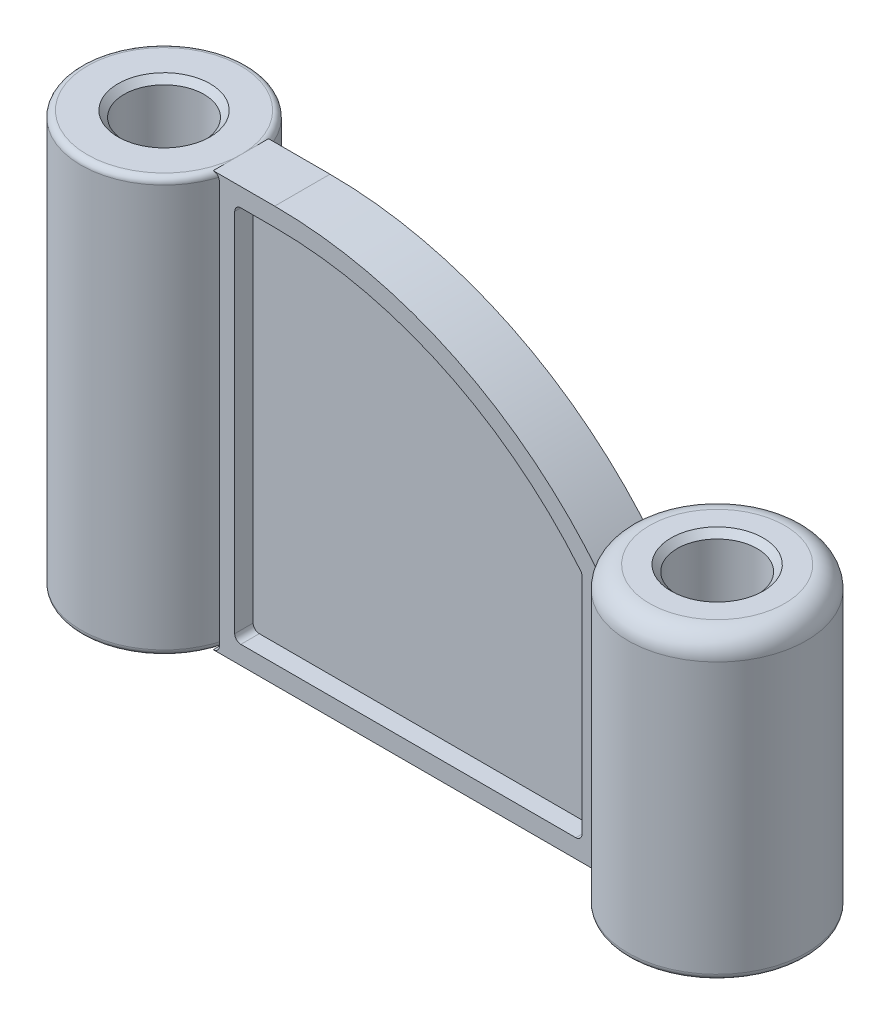
ISO-10303-21;
HEADER;
FILE_DESCRIPTION(('STEP AP214'),'2;1');
FILE_NAME('part.step','',(''),(''),'','','');
FILE_SCHEMA(('AUTOMOTIVE_DESIGN { 1 0 10303 214 1 1 1 1 }'));
ENDSEC;
DATA;
#1=APPLICATION_CONTEXT('core data for automotive mechanical design processes');
#2=APPLICATION_PROTOCOL_DEFINITION('international standard','automotive_design',2000,#1);
#3=PRODUCT_CONTEXT('',#1,'mechanical');
#4=PRODUCT('Part','Part','',(#3));
#5=PRODUCT_RELATED_PRODUCT_CATEGORY('part','',(#4));
#6=PRODUCT_DEFINITION_FORMATION('','',#4);
#7=PRODUCT_DEFINITION_CONTEXT('part definition',#1,'design');
#8=PRODUCT_DEFINITION('design','',#6,#7);
#9=PRODUCT_DEFINITION_SHAPE('','',#8);
#10=(LENGTH_UNIT() NAMED_UNIT(*) SI_UNIT(.MILLI.,.METRE.));
#11=(NAMED_UNIT(*) PLANE_ANGLE_UNIT() SI_UNIT($,.RADIAN.));
#12=(NAMED_UNIT(*) SI_UNIT($,.STERADIAN.) SOLID_ANGLE_UNIT());
#13=UNCERTAINTY_MEASURE_WITH_UNIT(LENGTH_MEASURE(1.E-05),#10,'distance_accuracy_value','');
#14=(GEOMETRIC_REPRESENTATION_CONTEXT(3) GLOBAL_UNCERTAINTY_ASSIGNED_CONTEXT((#13)) GLOBAL_UNIT_ASSIGNED_CONTEXT((#10,
#11,#12)) REPRESENTATION_CONTEXT('',''));
#15=CARTESIAN_POINT('',(0.,0.,0.));
#16=DIRECTION('',(0.,0.,1.));
#17=DIRECTION('',(1.,0.,0.));
#18=AXIS2_PLACEMENT_3D('',#15,#16,#17);
#19=CARTESIAN_POINT('',(54.,8.00000000000001,-9.));
#20=DIRECTION('',(0.,0.,1.));
#21=DIRECTION('',(1.,0.,0.));
#22=AXIS2_PLACEMENT_3D('',#19,#20,#21);
#23=CYLINDRICAL_SURFACE('',#22,2.00000000000001);
#24=CARTESIAN_POINT('',(54.,8.00000000000001,-3.));
#25=DIRECTION('',(0.,0.,1.));
#26=DIRECTION('',(1.,0.,0.));
#27=AXIS2_PLACEMENT_3D('',#24,#25,#26);
#28=CIRCLE('',#27,2.00000000000001);
#29=CARTESIAN_POINT('',(54.,6.,-3.));
#30=VERTEX_POINT('',#29);
#31=CARTESIAN_POINT('',(56.,8.00000000000001,-3.));
#32=VERTEX_POINT('',#31);
#33=EDGE_CURVE('E267',#30,#32,#28,.T.);
#34=ORIENTED_EDGE('',*,*,#33,.T.);
#35=DIRECTION('',(0.,0.,1.));
#36=VECTOR('',#35,1.);
#37=CARTESIAN_POINT('',(56.,8.00000000000001,-9.));
#38=LINE('',#37,#36);
#39=CARTESIAN_POINT('',(56.,8.00000000000001,-9.));
#40=VERTEX_POINT('',#39);
#41=EDGE_CURVE('E12',#40,#32,#38,.T.);
#42=ORIENTED_EDGE('',*,*,#41,.F.);
#43=CARTESIAN_POINT('',(54.,8.00000000000001,-9.));
#44=DIRECTION('',(0.,0.,1.));
#45=DIRECTION('',(1.,0.,0.));
#46=AXIS2_PLACEMENT_3D('',#43,#44,#45);
#47=CIRCLE('',#46,2.00000000000001);
#48=CARTESIAN_POINT('',(54.,6.,-9.));
#49=VERTEX_POINT('',#48);
#50=EDGE_CURVE('E337',#49,#40,#47,.T.);
#51=ORIENTED_EDGE('',*,*,#50,.F.);
#52=DIRECTION('',(0.,0.,1.));
#53=VECTOR('',#52,1.);
#54=CARTESIAN_POINT('',(54.,6.,-9.));
#55=LINE('',#54,#53);
#56=EDGE_CURVE('E229',#49,#30,#55,.T.);
#57=ORIENTED_EDGE('',*,*,#56,.T.);
#58=EDGE_LOOP('',(#34,#42,#51,#57));
#59=FACE_BOUND('',#58,.T.);
#60=ADVANCED_FACE('F43',(#59),#23,.F.);
#61=CARTESIAN_POINT('',(56.,0.,-9.));
#62=DIRECTION('',(-1.,0.,0.));
#63=DIRECTION('',(0.,-1.,0.));
#64=AXIS2_PLACEMENT_3D('',#61,#62,#63);
#65=PLANE('',#64);
#66=ORIENTED_EDGE('',*,*,#41,.T.);
#67=DIRECTION('',(0.,-1.,0.));
#68=VECTOR('',#67,1.);
#69=CARTESIAN_POINT('',(56.,0.,-3.));
#70=LINE('',#69,#68);
#71=CARTESIAN_POINT('',(56.,80.7774721070175,-3.));
#72=VERTEX_POINT('',#71);
#73=EDGE_CURVE('E236',#72,#32,#70,.T.);
#74=ORIENTED_EDGE('',*,*,#73,.F.);
#75=DIRECTION('',(0.,0.,1.));
#76=VECTOR('',#75,1.);
#77=CARTESIAN_POINT('',(56.,80.7774721070175,-9.));
#78=LINE('',#77,#76);
#79=CARTESIAN_POINT('',(56.,80.7774721070175,-9.));
#80=VERTEX_POINT('',#79);
#81=EDGE_CURVE('E358',#80,#72,#78,.T.);
#82=ORIENTED_EDGE('',*,*,#81,.F.);
#83=DIRECTION('',(0.,-1.,0.));
#84=VECTOR('',#83,1.);
#85=CARTESIAN_POINT('',(56.,0.,-9.));
#86=LINE('',#85,#84);
#87=EDGE_CURVE('E355',#80,#40,#86,.T.);
#88=ORIENTED_EDGE('',*,*,#87,.T.);
#89=EDGE_LOOP('',(#66,#74,#82,#88));
#90=FACE_BOUND('',#89,.T.);
#91=ADVANCED_FACE('F425',(#90),#65,.T.);
#92=CARTESIAN_POINT('',(54.,80.7774721070175,-9.));
#93=DIRECTION('',(0.,0.,1.));
#94=DIRECTION('',(1.,0.,0.));
#95=AXIS2_PLACEMENT_3D('',#92,#93,#94);
#96=CYLINDRICAL_SURFACE('',#95,1.99999999999997);
#97=CARTESIAN_POINT('',(54.,80.7774721070175,-3.));
#98=DIRECTION('',(0.,0.,1.));
#99=DIRECTION('',(1.,0.,0.));
#100=AXIS2_PLACEMENT_3D('',#97,#98,#99);
#101=CIRCLE('',#100,1.99999999999997);
#102=CARTESIAN_POINT('',(55.5433070866142,82.0495582819312,-3.));
#103=VERTEX_POINT('',#102);
#104=EDGE_CURVE('E248',#72,#103,#101,.T.);
#105=ORIENTED_EDGE('',*,*,#104,.T.);
#106=DIRECTION('',(0.,0.,1.));
#107=VECTOR('',#106,1.);
#108=CARTESIAN_POINT('',(55.5433070866142,82.0495582819312,-9.));
#109=LINE('',#108,#107);
#110=CARTESIAN_POINT('',(55.5433070866142,82.0495582819312,-9.));
#111=VERTEX_POINT('',#110);
#112=EDGE_CURVE('E362',#111,#103,#109,.T.);
#113=ORIENTED_EDGE('',*,*,#112,.F.);
#114=CARTESIAN_POINT('',(54.,80.7774721070175,-9.));
#115=DIRECTION('',(0.,0.,1.));
#116=DIRECTION('',(1.,0.,0.));
#117=AXIS2_PLACEMENT_3D('',#114,#115,#116);
#118=CIRCLE('',#117,1.99999999999997);
#119=EDGE_CURVE('E353',#80,#111,#118,.T.);
#120=ORIENTED_EDGE('',*,*,#119,.F.);
#121=ORIENTED_EDGE('',*,*,#81,.T.);
#122=EDGE_LOOP('',(#105,#113,#120,#121));
#123=FACE_BOUND('',#122,.T.);
#124=ADVANCED_FACE('F431',(#123),#96,.F.);
#125=CARTESIAN_POINT('',(-44.,0.,-9.));
#126=DIRECTION('',(0.,0.,1.));
#127=DIRECTION('',(1.,0.,0.));
#128=AXIS2_PLACEMENT_3D('',#125,#126,#127);
#129=CYLINDRICAL_SURFACE('',#128,129.);
#130=CARTESIAN_POINT('',(-44.,0.,-3.));
#131=DIRECTION('',(0.,0.,1.));
#132=DIRECTION('',(1.,0.,0.));
#133=AXIS2_PLACEMENT_3D('',#130,#131,#132);
#134=CIRCLE('',#133,129.);
#135=CARTESIAN_POINT('',(-44.,129.,-3.));
#136=VERTEX_POINT('',#135);
#137=EDGE_CURVE('E251',#103,#136,#134,.T.);
#138=ORIENTED_EDGE('',*,*,#137,.T.);
#139=DIRECTION('',(0.,0.,1.));
#140=VECTOR('',#139,1.);
#141=CARTESIAN_POINT('',(-44.,129.,-9.));
#142=LINE('',#141,#140);
#143=CARTESIAN_POINT('',(-44.,129.,-9.));
#144=VERTEX_POINT('',#143);
#145=EDGE_CURVE('E366',#144,#136,#142,.T.);
#146=ORIENTED_EDGE('',*,*,#145,.F.);
#147=CARTESIAN_POINT('',(-44.,0.,-9.));
#148=DIRECTION('',(0.,0.,1.));
#149=DIRECTION('',(1.,0.,0.));
#150=AXIS2_PLACEMENT_3D('',#147,#148,#149);
#151=CIRCLE('',#150,129.);
#152=EDGE_CURVE('E351',#111,#144,#151,.T.);
#153=ORIENTED_EDGE('',*,*,#152,.F.);
#154=ORIENTED_EDGE('',*,*,#112,.T.);
#155=EDGE_LOOP('',(#138,#146,#153,#154));
#156=FACE_BOUND('',#155,.T.);
#157=ADVANCED_FACE('F472',(#156),#129,.F.);
#158=CARTESIAN_POINT('',(0.,129.,-9.));
#159=DIRECTION('',(0.,1.,0.));
#160=DIRECTION('',(0.,0.,1.));
#161=AXIS2_PLACEMENT_3D('',#158,#159,#160);
#162=PLANE('',#161);
#163=DIRECTION('',(-1.,0.,0.));
#164=VECTOR('',#163,1.);
#165=CARTESIAN_POINT('',(0.,129.,-3.));
#166=LINE('',#165,#164);
#167=CARTESIAN_POINT('',(-55.,129.,-3.));
#168=VERTEX_POINT('',#167);
#169=EDGE_CURVE('E254',#136,#168,#166,.T.);
#170=ORIENTED_EDGE('',*,*,#169,.T.);
#171=DIRECTION('',(0.,0.,1.));
#172=VECTOR('',#171,1.);
#173=CARTESIAN_POINT('',(-55.,129.,-9.));
#174=LINE('',#173,#172);
#175=CARTESIAN_POINT('',(-55.,129.,-9.));
#176=VERTEX_POINT('',#175);
#177=EDGE_CURVE('E370',#176,#168,#174,.T.);
#178=ORIENTED_EDGE('',*,*,#177,.F.);
#179=DIRECTION('',(-1.,0.,0.));
#180=VECTOR('',#179,1.);
#181=CARTESIAN_POINT('',(0.,129.,-9.));
#182=LINE('',#181,#180);
#183=EDGE_CURVE('E349',#144,#176,#182,.T.);
#184=ORIENTED_EDGE('',*,*,#183,.F.);
#185=ORIENTED_EDGE('',*,*,#145,.T.);
#186=EDGE_LOOP('',(#170,#178,#184,#185));
#187=FACE_BOUND('',#186,.T.);
#188=ADVANCED_FACE('F468',(#187),#162,.F.);
#189=CARTESIAN_POINT('',(-55.,127.,-9.));
#190=DIRECTION('',(0.,0.,1.));
#191=DIRECTION('',(1.,0.,0.));
#192=AXIS2_PLACEMENT_3D('',#189,#190,#191);
#193=CYLINDRICAL_SURFACE('',#192,2.00000000000005);
#194=CARTESIAN_POINT('',(-55.,127.,-3.));
#195=DIRECTION('',(0.,0.,1.));
#196=DIRECTION('',(1.,0.,0.));
#197=AXIS2_PLACEMENT_3D('',#194,#195,#196);
#198=CIRCLE('',#197,2.00000000000005);
#199=CARTESIAN_POINT('',(-57.,127.,-3.));
#200=VERTEX_POINT('',#199);
#201=EDGE_CURVE('E257',#168,#200,#198,.T.);
#202=ORIENTED_EDGE('',*,*,#201,.T.);
#203=DIRECTION('',(0.,0.,1.));
#204=VECTOR('',#203,1.);
#205=CARTESIAN_POINT('',(-57.,127.,-9.));
#206=LINE('',#205,#204);
#207=CARTESIAN_POINT('',(-57.,127.,-9.));
#208=VERTEX_POINT('',#207);
#209=EDGE_CURVE('E374',#208,#200,#206,.T.);
#210=ORIENTED_EDGE('',*,*,#209,.F.);
#211=CARTESIAN_POINT('',(-55.,127.,-9.));
#212=DIRECTION('',(0.,0.,1.));
#213=DIRECTION('',(1.,0.,0.));
#214=AXIS2_PLACEMENT_3D('',#211,#212,#213);
#215=CIRCLE('',#214,2.00000000000005);
#216=EDGE_CURVE('E347',#176,#208,#215,.T.);
#217=ORIENTED_EDGE('',*,*,#216,.F.);
#218=ORIENTED_EDGE('',*,*,#177,.T.);
#219=EDGE_LOOP('',(#202,#210,#217,#218));
#220=FACE_BOUND('',#219,.T.);
#221=ADVANCED_FACE('F463',(#220),#193,.F.);
#222=CARTESIAN_POINT('',(-57.,0.,-9.));
#223=DIRECTION('',(1.,0.,0.));
#224=DIRECTION('',(0.,1.,0.));
#225=AXIS2_PLACEMENT_3D('',#222,#223,#224);
#226=PLANE('',#225);
#227=ORIENTED_EDGE('',*,*,#209,.T.);
#228=DIRECTION('',(0.,1.,0.));
#229=VECTOR('',#228,1.);
#230=CARTESIAN_POINT('',(-57.,0.,-3.));
#231=LINE('',#230,#229);
#232=CARTESIAN_POINT('',(-57.,7.99999999999999,-3.));
#233=VERTEX_POINT('',#232);
#234=EDGE_CURVE('E260',#233,#200,#231,.T.);
#235=ORIENTED_EDGE('',*,*,#234,.F.);
#236=DIRECTION('',(0.,0.,1.));
#237=VECTOR('',#236,1.);
#238=CARTESIAN_POINT('',(-57.,7.99999999999999,-9.));
#239=LINE('',#238,#237);
#240=CARTESIAN_POINT('',(-57.,7.99999999999999,-9.));
#241=VERTEX_POINT('',#240);
#242=EDGE_CURVE('E378',#241,#233,#239,.T.);
#243=ORIENTED_EDGE('',*,*,#242,.F.);
#244=DIRECTION('',(0.,1.,0.));
#245=VECTOR('',#244,1.);
#246=CARTESIAN_POINT('',(-57.,0.,-9.));
#247=LINE('',#246,#245);
#248=EDGE_CURVE('E344',#241,#208,#247,.T.);
#249=ORIENTED_EDGE('',*,*,#248,.T.);
#250=EDGE_LOOP('',(#227,#235,#243,#249));
#251=FACE_BOUND('',#250,.T.);
#252=ADVANCED_FACE('F447',(#251),#226,.T.);
#253=CARTESIAN_POINT('',(-55.,7.99999999999999,-9.));
#254=DIRECTION('',(0.,0.,1.));
#255=DIRECTION('',(1.,0.,0.));
#256=AXIS2_PLACEMENT_3D('',#253,#254,#255);
#257=CYLINDRICAL_SURFACE('',#256,2.);
#258=CARTESIAN_POINT('',(-55.,7.99999999999999,-3.));
#259=DIRECTION('',(0.,0.,1.));
#260=DIRECTION('',(1.,0.,0.));
#261=AXIS2_PLACEMENT_3D('',#258,#259,#260);
#262=CIRCLE('',#261,2.);
#263=CARTESIAN_POINT('',(-55.,5.99999999999999,-3.));
#264=VERTEX_POINT('',#263);
#265=EDGE_CURVE('E262',#233,#264,#262,.T.);
#266=ORIENTED_EDGE('',*,*,#265,.T.);
#267=DIRECTION('',(0.,0.,1.));
#268=VECTOR('',#267,1.);
#269=CARTESIAN_POINT('',(-55.,5.99999999999999,-9.));
#270=LINE('',#269,#268);
#271=CARTESIAN_POINT('',(-55.,5.99999999999999,-9.));
#272=VERTEX_POINT('',#271);
#273=EDGE_CURVE('E382',#272,#264,#270,.T.);
#274=ORIENTED_EDGE('',*,*,#273,.F.);
#275=CARTESIAN_POINT('',(-55.,7.99999999999999,-9.));
#276=DIRECTION('',(0.,0.,1.));
#277=DIRECTION('',(1.,0.,0.));
#278=AXIS2_PLACEMENT_3D('',#275,#276,#277);
#279=CIRCLE('',#278,2.);
#280=EDGE_CURVE('E342',#241,#272,#279,.T.);
#281=ORIENTED_EDGE('',*,*,#280,.F.);
#282=ORIENTED_EDGE('',*,*,#242,.T.);
#283=EDGE_LOOP('',(#266,#274,#281,#282));
#284=FACE_BOUND('',#283,.T.);
#285=ADVANCED_FACE('F442',(#284),#257,.F.);
#286=CARTESIAN_POINT('',(0.,5.99999999999999,-9.));
#287=DIRECTION('',(0.,1.,0.));
#288=DIRECTION('',(-1.,0.,0.));
#289=AXIS2_PLACEMENT_3D('',#286,#287,#288);
#290=PLANE('',#289);
#291=ORIENTED_EDGE('',*,*,#273,.T.);
#292=DIRECTION('',(-1.,0.,0.));
#293=VECTOR('',#292,1.);
#294=CARTESIAN_POINT('',(0.,5.99999999999999,-3.));
#295=LINE('',#294,#293);
#296=EDGE_CURVE('E265',#30,#264,#295,.T.);
#297=ORIENTED_EDGE('',*,*,#296,.F.);
#298=ORIENTED_EDGE('',*,*,#56,.F.);
#299=DIRECTION('',(-1.,0.,0.));
#300=VECTOR('',#299,1.);
#301=CARTESIAN_POINT('',(0.,5.99999999999999,-9.));
#302=LINE('',#301,#300);
#303=EDGE_CURVE('E339',#49,#272,#302,.T.);
#304=ORIENTED_EDGE('',*,*,#303,.T.);
#305=EDGE_LOOP('',(#291,#297,#298,#304));
#306=FACE_BOUND('',#305,.T.);
#307=ADVANCED_FACE('F420',(#306),#290,.T.);
#308=CARTESIAN_POINT('',(56.,8.00000000000001,3.));
#309=VERTEX_POINT('',#308);
#310=CARTESIAN_POINT('',(56.,8.00000000000001,9.));
#311=VERTEX_POINT('',#310);
#312=EDGE_CURVE('E52',#309,#311,#38,.T.);
#313=ORIENTED_EDGE('',*,*,#312,.F.);
#314=CARTESIAN_POINT('',(54.,8.00000000000001,3.));
#315=DIRECTION('',(0.,0.,1.));
#316=DIRECTION('',(1.,0.,0.));
#317=AXIS2_PLACEMENT_3D('',#314,#315,#316);
#318=CIRCLE('',#317,2.00000000000001);
#319=CARTESIAN_POINT('',(54.,6.,3.));
#320=VERTEX_POINT('',#319);
#321=EDGE_CURVE('E233',#320,#309,#318,.T.);
#322=ORIENTED_EDGE('',*,*,#321,.F.);
#323=CARTESIAN_POINT('',(54.,6.,9.));
#324=VERTEX_POINT('',#323);
#325=EDGE_CURVE('E218',#320,#324,#55,.T.);
#326=ORIENTED_EDGE('',*,*,#325,.T.);
#327=CARTESIAN_POINT('',(54.,8.00000000000001,9.));
#328=DIRECTION('',(0.,0.,1.));
#329=DIRECTION('',(1.,0.,0.));
#330=AXIS2_PLACEMENT_3D('',#327,#328,#329);
#331=CIRCLE('',#330,2.00000000000001);
#332=EDGE_CURVE('E294',#324,#311,#331,.T.);
#333=ORIENTED_EDGE('',*,*,#332,.T.);
#334=EDGE_LOOP('',(#313,#322,#326,#333));
#335=FACE_BOUND('',#334,.T.);
#336=ADVANCED_FACE('F234',(#335),#23,.F.);
#337=DIRECTION('',(0.,-1.,0.));
#338=VECTOR('',#337,1.);
#339=CARTESIAN_POINT('',(56.,0.,3.));
#340=LINE('',#339,#338);
#341=CARTESIAN_POINT('',(56.,80.7774721070175,3.));
#342=VERTEX_POINT('',#341);
#343=EDGE_CURVE('E60',#342,#309,#340,.T.);
#344=ORIENTED_EDGE('',*,*,#343,.T.);
#345=ORIENTED_EDGE('',*,*,#312,.T.);
#346=DIRECTION('',(0.,-1.,0.));
#347=VECTOR('',#346,1.);
#348=CARTESIAN_POINT('',(56.,0.,9.));
#349=LINE('',#348,#347);
#350=CARTESIAN_POINT('',(56.,80.7774721070175,9.));
#351=VERTEX_POINT('',#350);
#352=EDGE_CURVE('E315',#351,#311,#349,.T.);
#353=ORIENTED_EDGE('',*,*,#352,.F.);
#354=EDGE_CURVE('E361',#342,#351,#78,.T.);
#355=ORIENTED_EDGE('',*,*,#354,.F.);
#356=EDGE_LOOP('',(#344,#345,#353,#355));
#357=FACE_BOUND('',#356,.T.);
#358=ADVANCED_FACE('F434',(#357),#65,.T.);
#359=CARTESIAN_POINT('',(55.5433070866142,82.0495582819312,3.));
#360=VERTEX_POINT('',#359);
#361=CARTESIAN_POINT('',(55.5433070866142,82.0495582819312,9.));
#362=VERTEX_POINT('',#361);
#363=EDGE_CURVE('E365',#360,#362,#109,.T.);
#364=ORIENTED_EDGE('',*,*,#363,.F.);
#365=CARTESIAN_POINT('',(54.,80.7774721070175,3.));
#366=DIRECTION('',(0.,0.,1.));
#367=DIRECTION('',(1.,0.,0.));
#368=AXIS2_PLACEMENT_3D('',#365,#366,#367);
#369=CIRCLE('',#368,1.99999999999997);
#370=EDGE_CURVE('E68',#342,#360,#369,.T.);
#371=ORIENTED_EDGE('',*,*,#370,.F.);
#372=ORIENTED_EDGE('',*,*,#354,.T.);
#373=CARTESIAN_POINT('',(54.,80.7774721070175,9.));
#374=DIRECTION('',(0.,0.,1.));
#375=DIRECTION('',(1.,0.,0.));
#376=AXIS2_PLACEMENT_3D('',#373,#374,#375);
#377=CIRCLE('',#376,1.99999999999997);
#378=EDGE_CURVE('E312',#351,#362,#377,.T.);
#379=ORIENTED_EDGE('',*,*,#378,.T.);
#380=EDGE_LOOP('',(#364,#371,#372,#379));
#381=FACE_BOUND('',#380,.T.);
#382=ADVANCED_FACE('F441',(#381),#96,.F.);
#383=CARTESIAN_POINT('',(-44.,129.,3.));
#384=VERTEX_POINT('',#383);
#385=CARTESIAN_POINT('',(-44.,129.,9.));
#386=VERTEX_POINT('',#385);
#387=EDGE_CURVE('E369',#384,#386,#142,.T.);
#388=ORIENTED_EDGE('',*,*,#387,.F.);
#389=CARTESIAN_POINT('',(-44.,0.,3.));
#390=DIRECTION('',(0.,0.,1.));
#391=DIRECTION('',(1.,0.,0.));
#392=AXIS2_PLACEMENT_3D('',#389,#390,#391);
#393=CIRCLE('',#392,129.);
#394=EDGE_CURVE('E731',#360,#384,#393,.T.);
#395=ORIENTED_EDGE('',*,*,#394,.F.);
#396=ORIENTED_EDGE('',*,*,#363,.T.);
#397=CARTESIAN_POINT('',(-44.,0.,9.));
#398=DIRECTION('',(0.,0.,1.));
#399=DIRECTION('',(1.,0.,0.));
#400=AXIS2_PLACEMENT_3D('',#397,#398,#399);
#401=CIRCLE('',#400,129.);
#402=EDGE_CURVE('E309',#362,#386,#401,.T.);
#403=ORIENTED_EDGE('',*,*,#402,.T.);
#404=EDGE_LOOP('',(#388,#395,#396,#403));
#405=FACE_BOUND('',#404,.T.);
#406=ADVANCED_FACE('F466',(#405),#129,.F.);
#407=CARTESIAN_POINT('',(-55.,129.,3.));
#408=VERTEX_POINT('',#407);
#409=CARTESIAN_POINT('',(-55.,129.,9.));
#410=VERTEX_POINT('',#409);
#411=EDGE_CURVE('E373',#408,#410,#174,.T.);
#412=ORIENTED_EDGE('',*,*,#411,.F.);
#413=DIRECTION('',(-1.,0.,0.));
#414=VECTOR('',#413,1.);
#415=CARTESIAN_POINT('',(0.,129.,3.));
#416=LINE('',#415,#414);
#417=EDGE_CURVE('E733',#384,#408,#416,.T.);
#418=ORIENTED_EDGE('',*,*,#417,.F.);
#419=ORIENTED_EDGE('',*,*,#387,.T.);
#420=DIRECTION('',(-1.,0.,0.));
#421=VECTOR('',#420,1.);
#422=CARTESIAN_POINT('',(0.,129.,9.));
#423=LINE('',#422,#421);
#424=EDGE_CURVE('E306',#386,#410,#423,.T.);
#425=ORIENTED_EDGE('',*,*,#424,.T.);
#426=EDGE_LOOP('',(#412,#418,#419,#425));
#427=FACE_BOUND('',#426,.T.);
#428=ADVANCED_FACE('F461',(#427),#162,.F.);
#429=CARTESIAN_POINT('',(-57.,127.,3.));
#430=VERTEX_POINT('',#429);
#431=CARTESIAN_POINT('',(-57.,127.,9.));
#432=VERTEX_POINT('',#431);
#433=EDGE_CURVE('E377',#430,#432,#206,.T.);
#434=ORIENTED_EDGE('',*,*,#433,.F.);
#435=CARTESIAN_POINT('',(-55.,127.,3.));
#436=DIRECTION('',(0.,0.,1.));
#437=DIRECTION('',(1.,0.,0.));
#438=AXIS2_PLACEMENT_3D('',#435,#436,#437);
#439=CIRCLE('',#438,2.00000000000005);
#440=EDGE_CURVE('E738',#408,#430,#439,.T.);
#441=ORIENTED_EDGE('',*,*,#440,.F.);
#442=ORIENTED_EDGE('',*,*,#411,.T.);
#443=CARTESIAN_POINT('',(-55.,127.,9.));
#444=DIRECTION('',(0.,0.,1.));
#445=DIRECTION('',(1.,0.,0.));
#446=AXIS2_PLACEMENT_3D('',#443,#444,#445);
#447=CIRCLE('',#446,2.00000000000005);
#448=EDGE_CURVE('E303',#410,#432,#447,.T.);
#449=ORIENTED_EDGE('',*,*,#448,.T.);
#450=EDGE_LOOP('',(#434,#441,#442,#449));
#451=FACE_BOUND('',#450,.T.);
#452=ADVANCED_FACE('F457',(#451),#193,.F.);
#453=DIRECTION('',(0.,1.,0.));
#454=VECTOR('',#453,1.);
#455=CARTESIAN_POINT('',(-57.,0.,3.));
#456=LINE('',#455,#454);
#457=CARTESIAN_POINT('',(-57.,7.99999999999999,3.));
#458=VERTEX_POINT('',#457);
#459=EDGE_CURVE('E243',#458,#430,#456,.T.);
#460=ORIENTED_EDGE('',*,*,#459,.T.);
#461=ORIENTED_EDGE('',*,*,#433,.T.);
#462=DIRECTION('',(0.,1.,0.));
#463=VECTOR('',#462,1.);
#464=CARTESIAN_POINT('',(-57.,0.,9.));
#465=LINE('',#464,#463);
#466=CARTESIAN_POINT('',(-57.,7.99999999999999,9.));
#467=VERTEX_POINT('',#466);
#468=EDGE_CURVE('E300',#467,#432,#465,.T.);
#469=ORIENTED_EDGE('',*,*,#468,.F.);
#470=EDGE_CURVE('E381',#458,#467,#239,.T.);
#471=ORIENTED_EDGE('',*,*,#470,.F.);
#472=EDGE_LOOP('',(#460,#461,#469,#471));
#473=FACE_BOUND('',#472,.T.);
#474=ADVANCED_FACE('F453',(#473),#226,.T.);
#475=CARTESIAN_POINT('',(-55.,5.99999999999999,3.));
#476=VERTEX_POINT('',#475);
#477=CARTESIAN_POINT('',(-55.,5.99999999999999,9.));
#478=VERTEX_POINT('',#477);
#479=EDGE_CURVE('E384',#476,#478,#270,.T.);
#480=ORIENTED_EDGE('',*,*,#479,.F.);
#481=CARTESIAN_POINT('',(-55.,7.99999999999999,3.));
#482=DIRECTION('',(0.,0.,1.));
#483=DIRECTION('',(1.,0.,0.));
#484=AXIS2_PLACEMENT_3D('',#481,#482,#483);
#485=CIRCLE('',#484,2.);
#486=EDGE_CURVE('E241',#458,#476,#485,.T.);
#487=ORIENTED_EDGE('',*,*,#486,.F.);
#488=ORIENTED_EDGE('',*,*,#470,.T.);
#489=CARTESIAN_POINT('',(-55.,7.99999999999999,9.));
#490=DIRECTION('',(0.,0.,1.));
#491=DIRECTION('',(1.,0.,0.));
#492=AXIS2_PLACEMENT_3D('',#489,#490,#491);
#493=CIRCLE('',#492,2.);
#494=EDGE_CURVE('E297',#467,#478,#493,.T.);
#495=ORIENTED_EDGE('',*,*,#494,.T.);
#496=EDGE_LOOP('',(#480,#487,#488,#495));
#497=FACE_BOUND('',#496,.T.);
#498=ADVANCED_FACE('F450',(#497),#257,.F.);
#499=CARTESIAN_POINT('',(0.,0.,-9.));
#500=DIRECTION('',(0.,-1.,0.));
#501=DIRECTION('',(1.,0.,0.));
#502=AXIS2_PLACEMENT_3D('',#499,#500,#501);
#503=PLANE('',#502);
#504=DIRECTION('',(0.,0.,1.));
#505=VECTOR('',#504,1.);
#506=CARTESIAN_POINT('',(64.,0.,-9.));
#507=LINE('',#506,#505);
#508=CARTESIAN_POINT('',(64.,0.,-9.));
#509=VERTEX_POINT('',#508);
#510=CARTESIAN_POINT('',(64.,0.,9.));
#511=VERTEX_POINT('',#510);
#512=EDGE_CURVE('E47',#509,#511,#507,.T.);
#513=ORIENTED_EDGE('',*,*,#512,.T.);
#514=DIRECTION('',(1.,0.,0.));
#515=VECTOR('',#514,1.);
#516=CARTESIAN_POINT('',(0.,0.,9.));
#517=LINE('',#516,#515);
#518=CARTESIAN_POINT('',(-64.,0.,9.));
#519=VERTEX_POINT('',#518);
#520=EDGE_CURVE('E270',#519,#511,#517,.T.);
#521=ORIENTED_EDGE('',*,*,#520,.F.);
#522=DIRECTION('',(0.,0.,1.));
#523=VECTOR('',#522,1.);
#524=CARTESIAN_POINT('',(-64.,0.,-9.));
#525=LINE('',#524,#523);
#526=CARTESIAN_POINT('',(-64.,0.,-9.));
#527=VERTEX_POINT('',#526);
#528=EDGE_CURVE('E230',#527,#519,#525,.T.);
#529=ORIENTED_EDGE('',*,*,#528,.F.);
#530=DIRECTION('',(1.,0.,0.));
#531=VECTOR('',#530,1.);
#532=CARTESIAN_POINT('',(0.,0.,-9.));
#533=LINE('',#532,#531);
#534=EDGE_CURVE('E318',#527,#509,#533,.T.);
#535=ORIENTED_EDGE('',*,*,#534,.T.);
#536=EDGE_LOOP('',(#513,#521,#529,#535));
#537=FACE_BOUND('',#536,.T.);
#538=ADVANCED_FACE('F45',(#537),#503,.T.);
#539=CARTESIAN_POINT('',(-64.,2.00000000000001,-9.));
#540=DIRECTION('',(0.,0.,1.));
#541=DIRECTION('',(1.,0.,0.));
#542=AXIS2_PLACEMENT_3D('',#539,#540,#541);
#543=CYLINDRICAL_SURFACE('',#542,2.);
#544=ORIENTED_EDGE('',*,*,#528,.T.);
#545=CARTESIAN_POINT('',(-64.,2.00000000000001,9.));
#546=DIRECTION('',(0.,0.,1.));
#547=DIRECTION('',(1.,0.,0.));
#548=AXIS2_PLACEMENT_3D('',#545,#546,#547);
#549=CIRCLE('',#548,2.);
#550=CARTESIAN_POINT('',(-62.,2.00000000000001,9.));
#551=VERTEX_POINT('',#550);
#552=EDGE_CURVE('E291',#519,#551,#549,.T.);
#553=ORIENTED_EDGE('',*,*,#552,.T.);
#554=DIRECTION('',(0.,0.,1.));
#555=VECTOR('',#554,1.);
#556=CARTESIAN_POINT('',(-62.,2.00000000000001,-9.));
#557=LINE('',#556,#555);
#558=CARTESIAN_POINT('',(-62.,2.00000000000001,-9.));
#559=VERTEX_POINT('',#558);
#560=EDGE_CURVE('E388',#559,#551,#557,.T.);
#561=ORIENTED_EDGE('',*,*,#560,.F.);
#562=CARTESIAN_POINT('',(-64.,2.00000000000001,-9.));
#563=DIRECTION('',(0.,0.,1.));
#564=DIRECTION('',(1.,0.,0.));
#565=AXIS2_PLACEMENT_3D('',#562,#563,#564);
#566=CIRCLE('',#565,2.);
#567=EDGE_CURVE('E335',#527,#559,#566,.T.);
#568=ORIENTED_EDGE('',*,*,#567,.F.);
#569=EDGE_LOOP('',(#544,#553,#561,#568));
#570=FACE_BOUND('',#569,.T.);
#571=ADVANCED_FACE('F619',(#570),#543,.F.);
#572=CARTESIAN_POINT('',(-62.,0.,-9.));
#573=DIRECTION('',(1.,0.,0.));
#574=DIRECTION('',(0.,0.,-1.));
#575=AXIS2_PLACEMENT_3D('',#572,#573,#574);
#576=PLANE('',#575);
#577=ORIENTED_EDGE('',*,*,#560,.T.);
#578=DIRECTION('',(0.,1.,0.));
#579=VECTOR('',#578,1.);
#580=CARTESIAN_POINT('',(-62.,0.,9.));
#581=LINE('',#580,#579);
#582=CARTESIAN_POINT('',(-62.,133.,9.));
#583=VERTEX_POINT('',#582);
#584=EDGE_CURVE('E288',#551,#583,#581,.T.);
#585=ORIENTED_EDGE('',*,*,#584,.T.);
#586=DIRECTION('',(0.,0.,1.));
#587=VECTOR('',#586,1.);
#588=CARTESIAN_POINT('',(-62.,133.,-9.));
#589=LINE('',#588,#587);
#590=CARTESIAN_POINT('',(-62.,133.,-9.));
#591=VERTEX_POINT('',#590);
#592=EDGE_CURVE('E390',#591,#583,#589,.T.);
#593=ORIENTED_EDGE('',*,*,#592,.F.);
#594=DIRECTION('',(0.,1.,0.));
#595=VECTOR('',#594,1.);
#596=CARTESIAN_POINT('',(-62.,0.,-9.));
#597=LINE('',#596,#595);
#598=EDGE_CURVE('E333',#559,#591,#597,.T.);
#599=ORIENTED_EDGE('',*,*,#598,.F.);
#600=EDGE_LOOP('',(#577,#585,#593,#599));
#601=FACE_BOUND('',#600,.T.);
#602=ADVANCED_FACE('F609',(#601),#576,.F.);
#603=CARTESIAN_POINT('',(-64.,133.,-9.));
#604=DIRECTION('',(0.,0.,1.));
#605=DIRECTION('',(1.,0.,0.));
#606=AXIS2_PLACEMENT_3D('',#603,#604,#605);
#607=CYLINDRICAL_SURFACE('',#606,1.99999999999998);
#608=ORIENTED_EDGE('',*,*,#592,.T.);
#609=CARTESIAN_POINT('',(-64.,133.,9.));
#610=DIRECTION('',(0.,0.,1.));
#611=DIRECTION('',(1.,0.,0.));
#612=AXIS2_PLACEMENT_3D('',#609,#610,#611);
#613=CIRCLE('',#612,1.99999999999998);
#614=CARTESIAN_POINT('',(-64.,135.,9.));
#615=VERTEX_POINT('',#614);
#616=EDGE_CURVE('E285',#583,#615,#613,.T.);
#617=ORIENTED_EDGE('',*,*,#616,.T.);
#618=DIRECTION('',(0.,0.,1.));
#619=VECTOR('',#618,1.);
#620=CARTESIAN_POINT('',(-64.,135.,-9.));
#621=LINE('',#620,#619);
#622=CARTESIAN_POINT('',(-64.,135.,-9.));
#623=VERTEX_POINT('',#622);
#624=EDGE_CURVE('E392',#623,#615,#621,.T.);
#625=ORIENTED_EDGE('',*,*,#624,.F.);
#626=CARTESIAN_POINT('',(-64.,133.,-9.));
#627=DIRECTION('',(0.,0.,1.));
#628=DIRECTION('',(1.,0.,0.));
#629=AXIS2_PLACEMENT_3D('',#626,#627,#628);
#630=CIRCLE('',#629,1.99999999999998);
#631=EDGE_CURVE('E331',#591,#623,#630,.T.);
#632=ORIENTED_EDGE('',*,*,#631,.F.);
#633=EDGE_LOOP('',(#608,#617,#625,#632));
#634=FACE_BOUND('',#633,.T.);
#635=ADVANCED_FACE('F597',(#634),#607,.F.);
#636=CARTESIAN_POINT('',(-3.74700270810991E-13,135.,-9.));
#637=DIRECTION('',(0.,-1.,0.));
#638=DIRECTION('',(1.,0.,0.));
#639=AXIS2_PLACEMENT_3D('',#636,#637,#638);
#640=PLANE('',#639);
#641=ORIENTED_EDGE('',*,*,#624,.T.);
#642=DIRECTION('',(1.,0.,0.));
#643=VECTOR('',#642,1.);
#644=CARTESIAN_POINT('',(-3.74700270810991E-13,135.,9.));
#645=LINE('',#644,#643);
#646=CARTESIAN_POINT('',(-44.,135.,9.));
#647=VERTEX_POINT('',#646);
#648=EDGE_CURVE('E282',#615,#647,#645,.T.);
#649=ORIENTED_EDGE('',*,*,#648,.T.);
#650=DIRECTION('',(0.,0.,1.));
#651=VECTOR('',#650,1.);
#652=CARTESIAN_POINT('',(-44.,135.,-9.));
#653=LINE('',#652,#651);
#654=CARTESIAN_POINT('',(-44.,135.,-9.));
#655=VERTEX_POINT('',#654);
#656=EDGE_CURVE('E394',#655,#647,#653,.T.);
#657=ORIENTED_EDGE('',*,*,#656,.F.);
#658=DIRECTION('',(1.,0.,0.));
#659=VECTOR('',#658,1.);
#660=CARTESIAN_POINT('',(-3.74700270810991E-13,135.,-9.));
#661=LINE('',#660,#659);
#662=EDGE_CURVE('E329',#623,#655,#661,.T.);
#663=ORIENTED_EDGE('',*,*,#662,.F.);
#664=EDGE_LOOP('',(#641,#649,#657,#663));
#665=FACE_BOUND('',#664,.T.);
#666=ADVANCED_FACE('F588',(#665),#640,.F.);
#667=CARTESIAN_POINT('',(-44.,0.,-9.));
#668=DIRECTION('',(0.,0.,1.));
#669=DIRECTION('',(1.,0.,0.));
#670=AXIS2_PLACEMENT_3D('',#667,#668,#669);
#671=CYLINDRICAL_SURFACE('',#670,135.);
#672=ORIENTED_EDGE('',*,*,#656,.T.);
#673=CARTESIAN_POINT('',(-44.,0.,9.));
#674=DIRECTION('',(0.,0.,1.));
#675=DIRECTION('',(1.,0.,0.));
#676=AXIS2_PLACEMENT_3D('',#673,#674,#675);
#677=CIRCLE('',#676,135.);
#678=CARTESIAN_POINT('',(62.,83.6002392341074,9.));
#679=VERTEX_POINT('',#678);
#680=EDGE_CURVE('E279',#679,#647,#677,.T.);
#681=ORIENTED_EDGE('',*,*,#680,.F.);
#682=DIRECTION('',(0.,0.,1.));
#683=VECTOR('',#682,1.);
#684=CARTESIAN_POINT('',(62.,83.6002392341074,-9.));
#685=LINE('',#684,#683);
#686=CARTESIAN_POINT('',(62.,83.6002392341074,-9.));
#687=VERTEX_POINT('',#686);
#688=EDGE_CURVE('E396',#687,#679,#685,.T.);
#689=ORIENTED_EDGE('',*,*,#688,.F.);
#690=CARTESIAN_POINT('',(-44.,0.,-9.));
#691=DIRECTION('',(0.,0.,1.));
#692=DIRECTION('',(1.,0.,0.));
#693=AXIS2_PLACEMENT_3D('',#690,#691,#692);
#694=CIRCLE('',#693,135.);
#695=EDGE_CURVE('E326',#687,#655,#694,.T.);
#696=ORIENTED_EDGE('',*,*,#695,.T.);
#697=EDGE_LOOP('',(#672,#681,#689,#696));
#698=FACE_BOUND('',#697,.T.);
#699=ADVANCED_FACE('F421',(#698),#671,.T.);
#700=CARTESIAN_POINT('',(62.,0.,-9.));
#701=DIRECTION('',(1.,0.,0.));
#702=DIRECTION('',(0.,0.,-1.));
#703=AXIS2_PLACEMENT_3D('',#700,#701,#702);
#704=PLANE('',#703);
#705=ORIENTED_EDGE('',*,*,#688,.T.);
#706=DIRECTION('',(0.,1.,0.));
#707=VECTOR('',#706,1.);
#708=CARTESIAN_POINT('',(62.,0.,9.));
#709=LINE('',#708,#707);
#710=CARTESIAN_POINT('',(62.,1.99999999999998,9.));
#711=VERTEX_POINT('',#710);
#712=EDGE_CURVE('E276',#711,#679,#709,.T.);
#713=ORIENTED_EDGE('',*,*,#712,.F.);
#714=DIRECTION('',(0.,0.,1.));
#715=VECTOR('',#714,1.);
#716=CARTESIAN_POINT('',(62.,1.99999999999998,-9.));
#717=LINE('',#716,#715);
#718=CARTESIAN_POINT('',(62.,1.99999999999998,-9.));
#719=VERTEX_POINT('',#718);
#720=EDGE_CURVE('E397',#719,#711,#717,.T.);
#721=ORIENTED_EDGE('',*,*,#720,.F.);
#722=DIRECTION('',(0.,1.,0.));
#723=VECTOR('',#722,1.);
#724=CARTESIAN_POINT('',(62.,0.,-9.));
#725=LINE('',#724,#723);
#726=EDGE_CURVE('E323',#719,#687,#725,.T.);
#727=ORIENTED_EDGE('',*,*,#726,.T.);
#728=EDGE_LOOP('',(#705,#713,#721,#727));
#729=FACE_BOUND('',#728,.T.);
#730=ADVANCED_FACE('F413',(#729),#704,.T.);
#731=CARTESIAN_POINT('',(64.,1.99999999999998,-9.));
#732=DIRECTION('',(0.,0.,1.));
#733=DIRECTION('',(1.,0.,0.));
#734=AXIS2_PLACEMENT_3D('',#731,#732,#733);
#735=CYLINDRICAL_SURFACE('',#734,1.99999999999999);
#736=ORIENTED_EDGE('',*,*,#720,.T.);
#737=CARTESIAN_POINT('',(64.,1.99999999999998,9.));
#738=DIRECTION('',(0.,0.,1.));
#739=DIRECTION('',(1.,0.,0.));
#740=AXIS2_PLACEMENT_3D('',#737,#738,#739);
#741=CIRCLE('',#740,1.99999999999999);
#742=EDGE_CURVE('E273',#711,#511,#741,.T.);
#743=ORIENTED_EDGE('',*,*,#742,.T.);
#744=ORIENTED_EDGE('',*,*,#512,.F.);
#745=CARTESIAN_POINT('',(64.,1.99999999999998,-9.));
#746=DIRECTION('',(0.,0.,1.));
#747=DIRECTION('',(1.,0.,0.));
#748=AXIS2_PLACEMENT_3D('',#745,#746,#747);
#749=CIRCLE('',#748,1.99999999999999);
#750=EDGE_CURVE('E321',#719,#509,#749,.T.);
#751=ORIENTED_EDGE('',*,*,#750,.F.);
#752=EDGE_LOOP('',(#736,#743,#744,#751));
#753=FACE_BOUND('',#752,.T.);
#754=ADVANCED_FACE('F411',(#753),#735,.F.);
#755=DIRECTION('',(-1.,0.,0.));
#756=VECTOR('',#755,1.);
#757=CARTESIAN_POINT('',(0.,5.99999999999999,3.));
#758=LINE('',#757,#756);
#759=EDGE_CURVE('E222',#320,#476,#758,.T.);
#760=ORIENTED_EDGE('',*,*,#759,.T.);
#761=ORIENTED_EDGE('',*,*,#479,.T.);
#762=DIRECTION('',(-1.,0.,0.));
#763=VECTOR('',#762,1.);
#764=CARTESIAN_POINT('',(0.,5.99999999999999,9.));
#765=LINE('',#764,#763);
#766=EDGE_CURVE('E225',#324,#478,#765,.T.);
#767=ORIENTED_EDGE('',*,*,#766,.F.);
#768=ORIENTED_EDGE('',*,*,#325,.F.);
#769=EDGE_LOOP('',(#760,#761,#767,#768));
#770=FACE_BOUND('',#769,.T.);
#771=ADVANCED_FACE('F220',(#770),#290,.T.);
#772=CARTESIAN_POINT('',(0.,0.,-9.));
#773=DIRECTION('',(0.,0.,1.));
#774=DIRECTION('',(1.,0.,0.));
#775=AXIS2_PLACEMENT_3D('',#772,#773,#774);
#776=PLANE('',#775);
#777=ORIENTED_EDGE('',*,*,#534,.F.);
#778=ORIENTED_EDGE('',*,*,#567,.T.);
#779=ORIENTED_EDGE('',*,*,#598,.T.);
#780=ORIENTED_EDGE('',*,*,#631,.T.);
#781=ORIENTED_EDGE('',*,*,#662,.T.);
#782=ORIENTED_EDGE('',*,*,#695,.F.);
#783=ORIENTED_EDGE('',*,*,#726,.F.);
#784=ORIENTED_EDGE('',*,*,#750,.T.);
#785=EDGE_LOOP('',(#777,#778,#779,#780,#781,#782,#783,#784));
#786=FACE_BOUND('',#785,.T.);
#787=ORIENTED_EDGE('',*,*,#50,.T.);
#788=ORIENTED_EDGE('',*,*,#87,.F.);
#789=ORIENTED_EDGE('',*,*,#119,.T.);
#790=ORIENTED_EDGE('',*,*,#152,.T.);
#791=ORIENTED_EDGE('',*,*,#183,.T.);
#792=ORIENTED_EDGE('',*,*,#216,.T.);
#793=ORIENTED_EDGE('',*,*,#248,.F.);
#794=ORIENTED_EDGE('',*,*,#280,.T.);
#795=ORIENTED_EDGE('',*,*,#303,.F.);
#796=EDGE_LOOP('',(#787,#788,#789,#790,#791,#792,#793,#794,#795));
#797=FACE_BOUND('',#796,.T.);
#798=ADVANCED_FACE('F418',(#786,#797),#776,.F.);
#799=CARTESIAN_POINT('',(0.,0.,9.));
#800=DIRECTION('',(0.,0.,1.));
#801=DIRECTION('',(1.,0.,0.));
#802=AXIS2_PLACEMENT_3D('',#799,#800,#801);
#803=PLANE('',#802);
#804=ORIENTED_EDGE('',*,*,#520,.T.);
#805=ORIENTED_EDGE('',*,*,#742,.F.);
#806=ORIENTED_EDGE('',*,*,#712,.T.);
#807=ORIENTED_EDGE('',*,*,#680,.T.);
#808=ORIENTED_EDGE('',*,*,#648,.F.);
#809=ORIENTED_EDGE('',*,*,#616,.F.);
#810=ORIENTED_EDGE('',*,*,#584,.F.);
#811=ORIENTED_EDGE('',*,*,#552,.F.);
#812=EDGE_LOOP('',(#804,#805,#806,#807,#808,#809,#810,#811));
#813=FACE_BOUND('',#812,.T.);
#814=ORIENTED_EDGE('',*,*,#332,.F.);
#815=ORIENTED_EDGE('',*,*,#766,.T.);
#816=ORIENTED_EDGE('',*,*,#494,.F.);
#817=ORIENTED_EDGE('',*,*,#468,.T.);
#818=ORIENTED_EDGE('',*,*,#448,.F.);
#819=ORIENTED_EDGE('',*,*,#424,.F.);
#820=ORIENTED_EDGE('',*,*,#402,.F.);
#821=ORIENTED_EDGE('',*,*,#378,.F.);
#822=ORIENTED_EDGE('',*,*,#352,.T.);
#823=EDGE_LOOP('',(#814,#815,#816,#817,#818,#819,#820,#821,#822));
#824=FACE_BOUND('',#823,.T.);
#825=ADVANCED_FACE('F408',(#813,#824),#803,.T.);
#826=CARTESIAN_POINT('',(0.,0.,3.));
#827=DIRECTION('',(0.,0.,1.));
#828=DIRECTION('',(1.,0.,0.));
#829=AXIS2_PLACEMENT_3D('',#826,#827,#828);
#830=PLANE('',#829);
#831=ORIENTED_EDGE('',*,*,#343,.F.);
#832=ORIENTED_EDGE('',*,*,#370,.T.);
#833=ORIENTED_EDGE('',*,*,#394,.T.);
#834=ORIENTED_EDGE('',*,*,#417,.T.);
#835=ORIENTED_EDGE('',*,*,#440,.T.);
#836=ORIENTED_EDGE('',*,*,#459,.F.);
#837=ORIENTED_EDGE('',*,*,#486,.T.);
#838=ORIENTED_EDGE('',*,*,#759,.F.);
#839=ORIENTED_EDGE('',*,*,#321,.T.);
#840=EDGE_LOOP('',(#831,#832,#833,#834,#835,#836,#837,#838,#839));
#841=FACE_BOUND('',#840,.T.);
#842=ADVANCED_FACE('F239',(#841),#830,.T.);
#843=CARTESIAN_POINT('',(0.,0.,-3.));
#844=DIRECTION('',(0.,0.,1.));
#845=DIRECTION('',(1.,0.,0.));
#846=AXIS2_PLACEMENT_3D('',#843,#844,#845);
#847=PLANE('',#846);
#848=ORIENTED_EDGE('',*,*,#73,.T.);
#849=ORIENTED_EDGE('',*,*,#33,.F.);
#850=ORIENTED_EDGE('',*,*,#296,.T.);
#851=ORIENTED_EDGE('',*,*,#265,.F.);
#852=ORIENTED_EDGE('',*,*,#234,.T.);
#853=ORIENTED_EDGE('',*,*,#201,.F.);
#854=ORIENTED_EDGE('',*,*,#169,.F.);
#855=ORIENTED_EDGE('',*,*,#137,.F.);
#856=ORIENTED_EDGE('',*,*,#104,.F.);
#857=EDGE_LOOP('',(#848,#849,#850,#851,#852,#853,#854,#855,#856));
#858=FACE_BOUND('',#857,.T.);
#859=ADVANCED_FACE('F480',(#858),#847,.F.);
#860=CLOSED_SHELL('',(#60,#91,#124,#157,#188,#221,#252,#285,#307,#336,#358,#382,#406,#428,#452,
#474,#498,#538,#571,#602,#635,#666,#699,#730,#754,#771,#798,#825,#842,#859));
#861=MANIFOLD_SOLID_BREP('B2',#860);
#862=CARTESIAN_POINT('',(0.,0.,0.));
#863=DIRECTION('',(0.,1.,0.));
#864=DIRECTION('',(-1.,0.,0.));
#865=AXIS2_PLACEMENT_3D('',#862,#863,#864);
#866=PLANE('',#865);
#867=CARTESIAN_POINT('',(91.,0.,0.));
#868=DIRECTION('',(0.,1.,0.));
#869=DIRECTION('',(-1.,0.,0.));
#870=AXIS2_PLACEMENT_3D('',#867,#868,#869);
#871=CIRCLE('',#870,15.);
#872=CARTESIAN_POINT('',(76.,0.,0.));
#873=VERTEX_POINT('',#872);
#874=EDGE_CURVE('E774',#873,#873,#871,.T.);
#875=ORIENTED_EDGE('',*,*,#874,.T.);
#876=EDGE_LOOP('',(#875));
#877=FACE_BOUND('',#876,.T.);
#878=CARTESIAN_POINT('',(91.,0.,0.));
#879=DIRECTION('',(0.,1.,0.));
#880=DIRECTION('',(-1.,0.,0.));
#881=AXIS2_PLACEMENT_3D('',#878,#879,#880);
#882=CIRCLE('',#881,27.);
#883=CARTESIAN_POINT('',(64.,0.,0.));
#884=VERTEX_POINT('',#883);
#885=EDGE_CURVE('E782',#884,#884,#882,.T.);
#886=ORIENTED_EDGE('',*,*,#885,.F.);
#887=EDGE_LOOP('',(#886));
#888=FACE_BOUND('',#887,.T.);
#889=ADVANCED_FACE('F758',(#877,#888),#866,.F.);
#890=CARTESIAN_POINT('',(91.,1.99999999999998,0.));
#891=DIRECTION('',(0.,1.,0.));
#892=DIRECTION('',(-1.,0.,0.));
#893=AXIS2_PLACEMENT_3D('',#890,#891,#892);
#894=TOROIDAL_SURFACE('',#893,27.,1.99999999999999);
#895=ORIENTED_EDGE('',*,*,#885,.T.);
#896=EDGE_LOOP('',(#895));
#897=FACE_BOUND('',#896,.T.);
#898=CARTESIAN_POINT('',(91.,1.99999999999999,0.));
#899=DIRECTION('',(0.,1.,0.));
#900=DIRECTION('',(-1.,0.,0.));
#901=AXIS2_PLACEMENT_3D('',#898,#899,#900);
#902=CIRCLE('',#901,29.);
#903=CARTESIAN_POINT('',(62.,1.99999999999998,0.));
#904=VERTEX_POINT('',#903);
#905=EDGE_CURVE('E779',#904,#904,#902,.T.);
#906=ORIENTED_EDGE('',*,*,#905,.F.);
#907=EDGE_LOOP('',(#906));
#908=FACE_BOUND('',#907,.T.);
#909=ADVANCED_FACE('F798',(#897,#908),#894,.T.);
#910=CARTESIAN_POINT('',(91.,97.,0.));
#911=DIRECTION('',(0.,1.,0.));
#912=DIRECTION('',(-1.,0.,0.));
#913=AXIS2_PLACEMENT_3D('',#910,#911,#912);
#914=CYLINDRICAL_SURFACE('',#913,29.);
#915=CARTESIAN_POINT('',(91.,90.,0.));
#916=DIRECTION('',(0.,1.,0.));
#917=DIRECTION('',(-1.,0.,0.));
#918=AXIS2_PLACEMENT_3D('',#915,#916,#917);
#919=CIRCLE('',#918,29.);
#920=CARTESIAN_POINT('',(62.,90.,0.));
#921=VERTEX_POINT('',#920);
#922=EDGE_CURVE('E788',#921,#921,#919,.T.);
#923=ORIENTED_EDGE('',*,*,#922,.F.);
#924=EDGE_LOOP('',(#923));
#925=FACE_BOUND('',#924,.T.);
#926=ORIENTED_EDGE('',*,*,#905,.T.);
#927=EDGE_LOOP('',(#926));
#928=FACE_BOUND('',#927,.T.);
#929=ADVANCED_FACE('F795',(#925,#928),#914,.T.);
#930=CARTESIAN_POINT('',(91.,90.,0.));
#931=DIRECTION('',(0.,1.,0.));
#932=DIRECTION('',(-1.,0.,0.));
#933=AXIS2_PLACEMENT_3D('',#930,#931,#932);
#934=TOROIDAL_SURFACE('',#933,22.,7.00000000000001);
#935=ORIENTED_EDGE('',*,*,#922,.T.);
#936=EDGE_LOOP('',(#935));
#937=FACE_BOUND('',#936,.T.);
#938=CARTESIAN_POINT('',(91.,97.,0.));
#939=DIRECTION('',(0.,1.,0.));
#940=DIRECTION('',(-1.,0.,0.));
#941=AXIS2_PLACEMENT_3D('',#938,#939,#940);
#942=CIRCLE('',#941,22.);
#943=CARTESIAN_POINT('',(69.,97.,0.));
#944=VERTEX_POINT('',#943);
#945=EDGE_CURVE('E785',#944,#944,#942,.T.);
#946=ORIENTED_EDGE('',*,*,#945,.F.);
#947=EDGE_LOOP('',(#946));
#948=FACE_BOUND('',#947,.T.);
#949=ADVANCED_FACE('F792',(#937,#948),#934,.T.);
#950=CARTESIAN_POINT('',(0.,97.,0.));
#951=DIRECTION('',(0.,-1.,0.));
#952=DIRECTION('',(1.,0.,0.));
#953=AXIS2_PLACEMENT_3D('',#950,#951,#952);
#954=PLANE('',#953);
#955=CARTESIAN_POINT('',(91.,97.,0.));
#956=DIRECTION('',(0.,-1.,0.));
#957=DIRECTION('',(1.,0.,0.));
#958=AXIS2_PLACEMENT_3D('',#955,#956,#957);
#959=CIRCLE('',#958,15.);
#960=CARTESIAN_POINT('',(106.,97.,0.));
#961=VERTEX_POINT('',#960);
#962=EDGE_CURVE('E42',#961,#961,#959,.T.);
#963=ORIENTED_EDGE('',*,*,#962,.T.);
#964=EDGE_LOOP('',(#963));
#965=FACE_BOUND('',#964,.T.);
#966=ORIENTED_EDGE('',*,*,#945,.T.);
#967=EDGE_LOOP('',(#966));
#968=FACE_BOUND('',#967,.T.);
#969=ADVANCED_FACE('F800',(#965,#968),#954,.F.);
#970=CARTESIAN_POINT('',(91.,-10.,0.));
#971=DIRECTION('',(0.,1.,0.));
#972=DIRECTION('',(0.,0.,1.));
#973=AXIS2_PLACEMENT_3D('',#970,#971,#972);
#974=CYLINDRICAL_SURFACE('',#973,13.);
#975=CARTESIAN_POINT('',(91.,2.00000000000003,0.));
#976=DIRECTION('',(0.,1.,0.));
#977=DIRECTION('',(0.,0.,1.));
#978=AXIS2_PLACEMENT_3D('',#975,#976,#977);
#979=CIRCLE('',#978,13.);
#980=CARTESIAN_POINT('',(91.,2.00000000000003,13.));
#981=VERTEX_POINT('',#980);
#982=EDGE_CURVE('E766',#981,#981,#979,.F.);
#983=ORIENTED_EDGE('',*,*,#982,.T.);
#984=EDGE_LOOP('',(#983));
#985=FACE_BOUND('',#984,.T.);
#986=CARTESIAN_POINT('',(91.,95.,0.));
#987=DIRECTION('',(0.,-1.,0.));
#988=DIRECTION('',(0.,0.,-1.));
#989=AXIS2_PLACEMENT_3D('',#986,#987,#988);
#990=CIRCLE('',#989,13.);
#991=CARTESIAN_POINT('',(91.,95.,-13.));
#992=VERTEX_POINT('',#991);
#993=EDGE_CURVE('E770',#992,#992,#990,.F.);
#994=ORIENTED_EDGE('',*,*,#993,.T.);
#995=EDGE_LOOP('',(#994));
#996=FACE_BOUND('',#995,.T.);
#997=ADVANCED_FACE('F812',(#985,#996),#974,.F.);
#998=CARTESIAN_POINT('',(91.,0.,0.));
#999=DIRECTION('',(0.,-1.,0.));
#1000=DIRECTION('',(0.,0.,-1.));
#1001=AXIS2_PLACEMENT_3D('',#998,#999,#1000);
#1002=CONICAL_SURFACE('',#1001,15.,0.78539816339744);
#1003=ORIENTED_EDGE('',*,*,#982,.F.);
#1004=EDGE_LOOP('',(#1003));
#1005=FACE_BOUND('',#1004,.T.);
#1006=ORIENTED_EDGE('',*,*,#874,.F.);
#1007=EDGE_LOOP('',(#1006));
#1008=FACE_BOUND('',#1007,.T.);
#1009=ADVANCED_FACE('F822',(#1005,#1008),#1002,.F.);
#1010=CARTESIAN_POINT('',(91.,97.,0.));
#1011=DIRECTION('',(0.,1.,0.));
#1012=DIRECTION('',(0.,0.,1.));
#1013=AXIS2_PLACEMENT_3D('',#1010,#1011,#1012);
#1014=CONICAL_SURFACE('',#1013,15.,0.785398163397444);
#1015=ORIENTED_EDGE('',*,*,#993,.F.);
#1016=EDGE_LOOP('',(#1015));
#1017=FACE_BOUND('',#1016,.T.);
#1018=ORIENTED_EDGE('',*,*,#962,.F.);
#1019=EDGE_LOOP('',(#1018));
#1020=FACE_BOUND('',#1019,.T.);
#1021=ADVANCED_FACE('F761',(#1017,#1020),#1014,.F.);
#1022=CLOSED_SHELL('',(#889,#909,#929,#949,#969,#997,#1009,#1021));
#1023=MANIFOLD_SOLID_BREP('B6',#1022);
#1024=CARTESIAN_POINT('',(-89.,135.,0.));
#1025=DIRECTION('',(0.,1.,0.));
#1026=DIRECTION('',(0.,0.,1.));
#1027=AXIS2_PLACEMENT_3D('',#1024,#1025,#1026);
#1028=CYLINDRICAL_SURFACE('',#1027,27.);
#1029=CARTESIAN_POINT('',(-89.,133.,0.));
#1030=DIRECTION('',(0.,1.,0.));
#1031=DIRECTION('',(0.,0.,1.));
#1032=AXIS2_PLACEMENT_3D('',#1029,#1030,#1031);
#1033=CIRCLE('',#1032,27.);
#1034=CARTESIAN_POINT('',(-89.,133.,27.));
#1035=VERTEX_POINT('',#1034);
#1036=EDGE_CURVE('E922',#1035,#1035,#1033,.T.);
#1037=ORIENTED_EDGE('',*,*,#1036,.F.);
#1038=EDGE_LOOP('',(#1037));
#1039=FACE_BOUND('',#1038,.T.);
#1040=CARTESIAN_POINT('',(-89.,2.,0.));
#1041=DIRECTION('',(0.,1.,0.));
#1042=DIRECTION('',(0.,0.,1.));
#1043=AXIS2_PLACEMENT_3D('',#1040,#1041,#1042);
#1044=CIRCLE('',#1043,27.);
#1045=CARTESIAN_POINT('',(-89.,2.,27.));
#1046=VERTEX_POINT('',#1045);
#1047=EDGE_CURVE('E931',#1046,#1046,#1044,.T.);
#1048=ORIENTED_EDGE('',*,*,#1047,.T.);
#1049=EDGE_LOOP('',(#1048));
#1050=FACE_BOUND('',#1049,.T.);
#1051=ADVANCED_FACE('F901',(#1039,#1050),#1028,.T.);
#1052=CARTESIAN_POINT('',(-89.,133.,0.));
#1053=DIRECTION('',(0.,1.,0.));
#1054=DIRECTION('',(0.,0.,1.));
#1055=AXIS2_PLACEMENT_3D('',#1052,#1053,#1054);
#1056=TOROIDAL_SURFACE('',#1055,25.,1.99999999999998);
#1057=CARTESIAN_POINT('',(-89.,135.,0.));
#1058=DIRECTION('',(0.,1.,0.));
#1059=DIRECTION('',(0.,0.,1.));
#1060=AXIS2_PLACEMENT_3D('',#1057,#1058,#1059);
#1061=CIRCLE('',#1060,25.);
#1062=CARTESIAN_POINT('',(-89.,135.,25.));
#1063=VERTEX_POINT('',#1062);
#1064=EDGE_CURVE('E925',#1063,#1063,#1061,.T.);
#1065=ORIENTED_EDGE('',*,*,#1064,.F.);
#1066=EDGE_LOOP('',(#1065));
#1067=FACE_BOUND('',#1066,.T.);
#1068=ORIENTED_EDGE('',*,*,#1036,.T.);
#1069=EDGE_LOOP('',(#1068));
#1070=FACE_BOUND('',#1069,.T.);
#1071=ADVANCED_FACE('F952',(#1067,#1070),#1056,.T.);
#1072=CARTESIAN_POINT('',(2.99760216648792E-13,135.,0.));
#1073=DIRECTION('',(0.,-1.,0.));
#1074=DIRECTION('',(0.,0.,-1.));
#1075=AXIS2_PLACEMENT_3D('',#1072,#1073,#1074);
#1076=PLANE('',#1075);
#1077=CARTESIAN_POINT('',(-89.,135.,0.));
#1078=DIRECTION('',(0.,-1.,0.));
#1079=DIRECTION('',(0.,0.,-1.));
#1080=AXIS2_PLACEMENT_3D('',#1077,#1078,#1079);
#1081=CIRCLE('',#1080,15.);
#1082=CARTESIAN_POINT('',(-89.,135.,-15.));
#1083=VERTEX_POINT('',#1082);
#1084=EDGE_CURVE('E757',#1083,#1083,#1081,.T.);
#1085=ORIENTED_EDGE('',*,*,#1084,.T.);
#1086=EDGE_LOOP('',(#1085));
#1087=FACE_BOUND('',#1086,.T.);
#1088=ORIENTED_EDGE('',*,*,#1064,.T.);
#1089=EDGE_LOOP('',(#1088));
#1090=FACE_BOUND('',#1089,.T.);
#1091=ADVANCED_FACE('F945',(#1087,#1090),#1076,.F.);
#1092=CARTESIAN_POINT('',(0.,0.,0.));
#1093=DIRECTION('',(0.,1.,0.));
#1094=DIRECTION('',(0.,0.,1.));
#1095=AXIS2_PLACEMENT_3D('',#1092,#1093,#1094);
#1096=PLANE('',#1095);
#1097=CARTESIAN_POINT('',(-89.,0.,0.));
#1098=DIRECTION('',(0.,1.,0.));
#1099=DIRECTION('',(0.,0.,1.));
#1100=AXIS2_PLACEMENT_3D('',#1097,#1098,#1099);
#1101=CIRCLE('',#1100,15.);
#1102=CARTESIAN_POINT('',(-89.,0.,15.));
#1103=VERTEX_POINT('',#1102);
#1104=EDGE_CURVE('E917',#1103,#1103,#1101,.T.);
#1105=ORIENTED_EDGE('',*,*,#1104,.T.);
#1106=EDGE_LOOP('',(#1105));
#1107=FACE_BOUND('',#1106,.T.);
#1108=CARTESIAN_POINT('',(-89.,0.,0.));
#1109=DIRECTION('',(0.,1.,0.));
#1110=DIRECTION('',(0.,0.,1.));
#1111=AXIS2_PLACEMENT_3D('',#1108,#1109,#1110);
#1112=CIRCLE('',#1111,25.);
#1113=CARTESIAN_POINT('',(-89.,0.,25.));
#1114=VERTEX_POINT('',#1113);
#1115=EDGE_CURVE('E928',#1114,#1114,#1112,.T.);
#1116=ORIENTED_EDGE('',*,*,#1115,.F.);
#1117=EDGE_LOOP('',(#1116));
#1118=FACE_BOUND('',#1117,.T.);
#1119=ADVANCED_FACE('F940',(#1107,#1118),#1096,.F.);
#1120=CARTESIAN_POINT('',(-89.,2.00000000000001,0.));
#1121=DIRECTION('',(0.,1.,0.));
#1122=DIRECTION('',(0.,0.,1.));
#1123=AXIS2_PLACEMENT_3D('',#1120,#1121,#1122);
#1124=TOROIDAL_SURFACE('',#1123,25.,2.);
#1125=ORIENTED_EDGE('',*,*,#1047,.F.);
#1126=EDGE_LOOP('',(#1125));
#1127=FACE_BOUND('',#1126,.T.);
#1128=ORIENTED_EDGE('',*,*,#1115,.T.);
#1129=EDGE_LOOP('',(#1128));
#1130=FACE_BOUND('',#1129,.T.);
#1131=ADVANCED_FACE('F936',(#1127,#1130),#1124,.T.);
#1132=CARTESIAN_POINT('',(-89.,-10.,0.));
#1133=DIRECTION('',(0.,1.,0.));
#1134=DIRECTION('',(0.,0.,1.));
#1135=AXIS2_PLACEMENT_3D('',#1132,#1133,#1134);
#1136=CYLINDRICAL_SURFACE('',#1135,13.);
#1137=CARTESIAN_POINT('',(-89.,2.00000000000002,0.));
#1138=DIRECTION('',(0.,1.,0.));
#1139=DIRECTION('',(0.,0.,1.));
#1140=AXIS2_PLACEMENT_3D('',#1137,#1138,#1139);
#1141=CIRCLE('',#1140,13.);
#1142=CARTESIAN_POINT('',(-89.,2.00000000000002,13.));
#1143=VERTEX_POINT('',#1142);
#1144=EDGE_CURVE('E909',#1143,#1143,#1141,.F.);
#1145=ORIENTED_EDGE('',*,*,#1144,.T.);
#1146=EDGE_LOOP('',(#1145));
#1147=FACE_BOUND('',#1146,.T.);
#1148=CARTESIAN_POINT('',(-89.,133.,0.));
#1149=DIRECTION('',(0.,-1.,0.));
#1150=DIRECTION('',(0.,0.,-1.));
#1151=AXIS2_PLACEMENT_3D('',#1148,#1149,#1150);
#1152=CIRCLE('',#1151,13.);
#1153=CARTESIAN_POINT('',(-89.,133.,-13.));
#1154=VERTEX_POINT('',#1153);
#1155=EDGE_CURVE('E913',#1154,#1154,#1152,.F.);
#1156=ORIENTED_EDGE('',*,*,#1155,.T.);
#1157=EDGE_LOOP('',(#1156));
#1158=FACE_BOUND('',#1157,.T.);
#1159=ADVANCED_FACE('F939',(#1147,#1158),#1136,.F.);
#1160=CARTESIAN_POINT('',(-89.,0.,0.));
#1161=DIRECTION('',(0.,-1.,0.));
#1162=DIRECTION('',(0.,0.,-1.));
#1163=AXIS2_PLACEMENT_3D('',#1160,#1161,#1162);
#1164=CONICAL_SURFACE('',#1163,15.,0.785398163397446);
#1165=ORIENTED_EDGE('',*,*,#1144,.F.);
#1166=EDGE_LOOP('',(#1165));
#1167=FACE_BOUND('',#1166,.T.);
#1168=ORIENTED_EDGE('',*,*,#1104,.F.);
#1169=EDGE_LOOP('',(#1168));
#1170=FACE_BOUND('',#1169,.T.);
#1171=ADVANCED_FACE('F964',(#1167,#1170),#1164,.F.);
#1172=CARTESIAN_POINT('',(-89.,135.,0.));
#1173=DIRECTION('',(0.,1.,0.));
#1174=DIRECTION('',(0.,0.,1.));
#1175=AXIS2_PLACEMENT_3D('',#1172,#1173,#1174);
#1176=CONICAL_SURFACE('',#1175,15.,0.785398163397447);
#1177=ORIENTED_EDGE('',*,*,#1155,.F.);
#1178=EDGE_LOOP('',(#1177));
#1179=FACE_BOUND('',#1178,.T.);
#1180=ORIENTED_EDGE('',*,*,#1084,.F.);
#1181=EDGE_LOOP('',(#1180));
#1182=FACE_BOUND('',#1181,.T.);
#1183=ADVANCED_FACE('F904',(#1179,#1182),#1176,.F.);
#1184=CLOSED_SHELL('',(#1051,#1071,#1091,#1119,#1131,#1159,#1171,#1183));
#1185=MANIFOLD_SOLID_BREP('B37',#1184);
#1186=ADVANCED_BREP_SHAPE_REPRESENTATION('',(#18,#861,#1023,#1185),#14);
#1187=SHAPE_DEFINITION_REPRESENTATION(#9,#1186);
ENDSEC;
END-ISO-10303-21;
